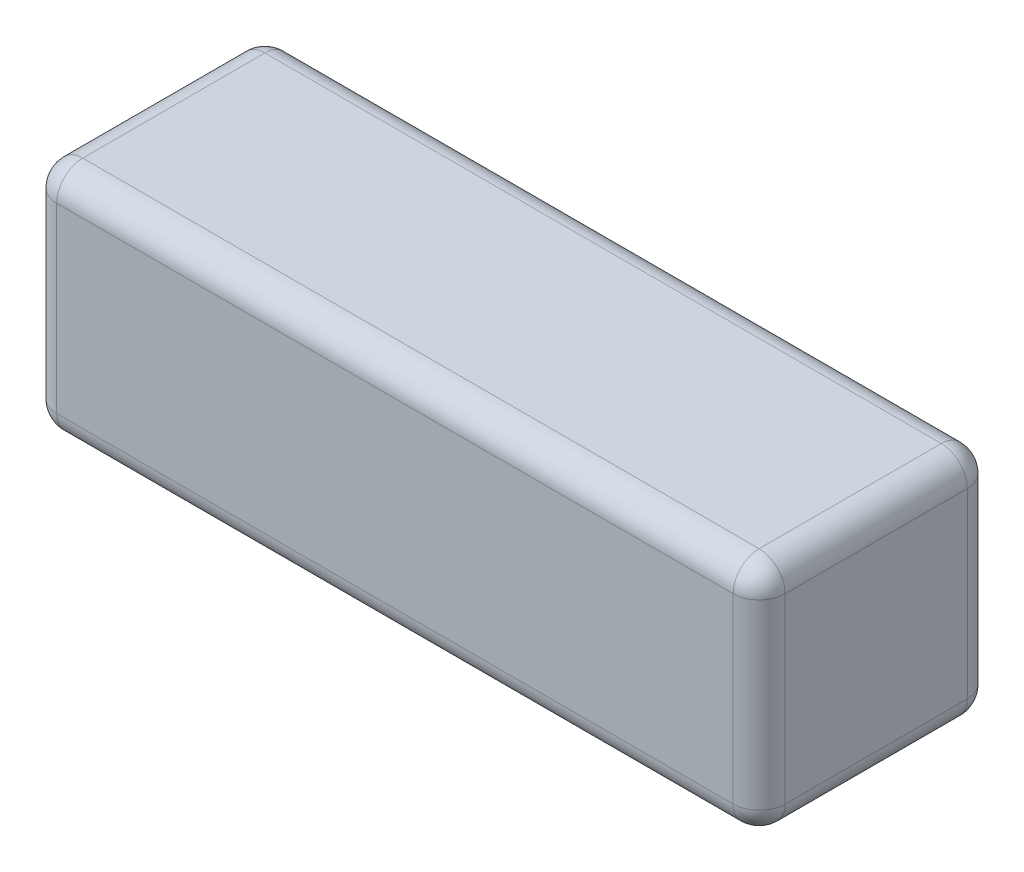
ISO-10303-21;
HEADER;
FILE_DESCRIPTION(('STEP AP214'),'2;1');
FILE_NAME('part.step','',(''),(''),'','','');
FILE_SCHEMA(('AUTOMOTIVE_DESIGN { 1 0 10303 214 1 1 1 1 }'));
ENDSEC;
DATA;
#1=APPLICATION_CONTEXT('core data for automotive mechanical design processes');
#2=APPLICATION_PROTOCOL_DEFINITION('international standard','automotive_design',2000,#1);
#3=PRODUCT_CONTEXT('',#1,'mechanical');
#4=PRODUCT('Part','Part','',(#3));
#5=PRODUCT_RELATED_PRODUCT_CATEGORY('part','',(#4));
#6=PRODUCT_DEFINITION_FORMATION('','',#4);
#7=PRODUCT_DEFINITION_CONTEXT('part definition',#1,'design');
#8=PRODUCT_DEFINITION('design','',#6,#7);
#9=PRODUCT_DEFINITION_SHAPE('','',#8);
#10=(LENGTH_UNIT() NAMED_UNIT(*) SI_UNIT(.MILLI.,.METRE.));
#11=(NAMED_UNIT(*) PLANE_ANGLE_UNIT() SI_UNIT($,.RADIAN.));
#12=(NAMED_UNIT(*) SI_UNIT($,.STERADIAN.) SOLID_ANGLE_UNIT());
#13=UNCERTAINTY_MEASURE_WITH_UNIT(LENGTH_MEASURE(1.E-05),#10,'distance_accuracy_value','');
#14=(GEOMETRIC_REPRESENTATION_CONTEXT(3) GLOBAL_UNCERTAINTY_ASSIGNED_CONTEXT((#13)) GLOBAL_UNIT_ASSIGNED_CONTEXT((#10,
#11,#12)) REPRESENTATION_CONTEXT('',''));
#15=CARTESIAN_POINT('',(0.,0.,0.));
#16=DIRECTION('',(0.,0.,1.));
#17=DIRECTION('',(1.,0.,0.));
#18=AXIS2_PLACEMENT_3D('',#15,#16,#17);
#19=CARTESIAN_POINT('',(70.,-22.5,45.));
#20=DIRECTION('',(-1.,0.,0.));
#21=DIRECTION('',(0.,0.,1.));
#22=AXIS2_PLACEMENT_3D('',#19,#20,#21);
#23=PLANE('',#22);
#24=DIRECTION('',(0.,1.,0.));
#25=VECTOR('',#24,1.);
#26=CARTESIAN_POINT('',(70.,-22.5,40.));
#27=LINE('',#26,#25);
#28=CARTESIAN_POINT('',(70.,17.5,40.));
#29=VERTEX_POINT('',#28);
#30=CARTESIAN_POINT('',(70.,-17.5,40.));
#31=VERTEX_POINT('',#30);
#32=EDGE_CURVE('E183',#29,#31,#27,.F.);
#33=ORIENTED_EDGE('',*,*,#32,.T.);
#34=DIRECTION('',(0.,0.,-1.));
#35=VECTOR('',#34,1.);
#36=CARTESIAN_POINT('',(70.,-17.5,45.));
#37=LINE('',#36,#35);
#38=CARTESIAN_POINT('',(70.,-17.5,5.));
#39=VERTEX_POINT('',#38);
#40=EDGE_CURVE('E188',#31,#39,#37,.T.);
#41=ORIENTED_EDGE('',*,*,#40,.T.);
#42=DIRECTION('',(0.,1.,0.));
#43=VECTOR('',#42,1.);
#44=CARTESIAN_POINT('',(70.,22.5,5.));
#45=LINE('',#44,#43);
#46=CARTESIAN_POINT('',(70.,17.5,5.));
#47=VERTEX_POINT('',#46);
#48=EDGE_CURVE('E185',#39,#47,#45,.T.);
#49=ORIENTED_EDGE('',*,*,#48,.T.);
#50=DIRECTION('',(0.,0.,-1.));
#51=VECTOR('',#50,1.);
#52=CARTESIAN_POINT('',(70.,17.5,45.));
#53=LINE('',#52,#51);
#54=EDGE_CURVE('E181',#47,#29,#53,.F.);
#55=ORIENTED_EDGE('',*,*,#54,.T.);
#56=EDGE_LOOP('',(#33,#41,#49,#55));
#57=FACE_BOUND('',#56,.T.);
#58=ADVANCED_FACE('F41',(#57),#23,.F.);
#59=CARTESIAN_POINT('',(-70.,22.5,45.));
#60=DIRECTION('',(0.,-1.,0.));
#61=DIRECTION('',(0.,0.,-1.));
#62=AXIS2_PLACEMENT_3D('',#59,#60,#61);
#63=PLANE('',#62);
#64=DIRECTION('',(-1.,0.,0.));
#65=VECTOR('',#64,1.);
#66=CARTESIAN_POINT('',(-70.,22.5,40.));
#67=LINE('',#66,#65);
#68=CARTESIAN_POINT('',(-65.,22.5,40.));
#69=VERTEX_POINT('',#68);
#70=CARTESIAN_POINT('',(65.,22.5,40.));
#71=VERTEX_POINT('',#70);
#72=EDGE_CURVE('E50',#69,#71,#67,.F.);
#73=ORIENTED_EDGE('',*,*,#72,.T.);
#74=DIRECTION('',(0.,0.,-1.));
#75=VECTOR('',#74,1.);
#76=CARTESIAN_POINT('',(65.,22.5,45.));
#77=LINE('',#76,#75);
#78=CARTESIAN_POINT('',(65.,22.5,5.));
#79=VERTEX_POINT('',#78);
#80=EDGE_CURVE('E11',#71,#79,#77,.T.);
#81=ORIENTED_EDGE('',*,*,#80,.T.);
#82=DIRECTION('',(-1.,0.,0.));
#83=VECTOR('',#82,1.);
#84=CARTESIAN_POINT('',(-70.,22.5,5.));
#85=LINE('',#84,#83);
#86=CARTESIAN_POINT('',(-65.,22.5,5.));
#87=VERTEX_POINT('',#86);
#88=EDGE_CURVE('E206',#79,#87,#85,.T.);
#89=ORIENTED_EDGE('',*,*,#88,.T.);
#90=DIRECTION('',(0.,0.,-1.));
#91=VECTOR('',#90,1.);
#92=CARTESIAN_POINT('',(-65.,22.5,45.));
#93=LINE('',#92,#91);
#94=EDGE_CURVE('E61',#87,#69,#93,.F.);
#95=ORIENTED_EDGE('',*,*,#94,.T.);
#96=EDGE_LOOP('',(#73,#81,#89,#95));
#97=FACE_BOUND('',#96,.T.);
#98=ADVANCED_FACE('F315',(#97),#63,.F.);
#99=CARTESIAN_POINT('',(-70.,-22.5,45.));
#100=DIRECTION('',(1.,0.,0.));
#101=DIRECTION('',(0.,0.,-1.));
#102=AXIS2_PLACEMENT_3D('',#99,#100,#101);
#103=PLANE('',#102);
#104=DIRECTION('',(0.,-1.,0.));
#105=VECTOR('',#104,1.);
#106=CARTESIAN_POINT('',(-70.,-22.5,5.));
#107=LINE('',#106,#105);
#108=CARTESIAN_POINT('',(-70.,17.5,5.));
#109=VERTEX_POINT('',#108);
#110=CARTESIAN_POINT('',(-70.,-17.5,5.));
#111=VERTEX_POINT('',#110);
#112=EDGE_CURVE('E140',#109,#111,#107,.T.);
#113=ORIENTED_EDGE('',*,*,#112,.T.);
#114=DIRECTION('',(0.,0.,-1.));
#115=VECTOR('',#114,1.);
#116=CARTESIAN_POINT('',(-70.,-17.5,45.));
#117=LINE('',#116,#115);
#118=CARTESIAN_POINT('',(-70.,-17.5,40.));
#119=VERTEX_POINT('',#118);
#120=EDGE_CURVE('E136',#111,#119,#117,.F.);
#121=ORIENTED_EDGE('',*,*,#120,.T.);
#122=DIRECTION('',(0.,-1.,0.));
#123=VECTOR('',#122,1.);
#124=CARTESIAN_POINT('',(-70.,-22.5,40.));
#125=LINE('',#124,#123);
#126=CARTESIAN_POINT('',(-70.,17.5,40.));
#127=VERTEX_POINT('',#126);
#128=EDGE_CURVE('E128',#119,#127,#125,.F.);
#129=ORIENTED_EDGE('',*,*,#128,.T.);
#130=DIRECTION('',(0.,0.,-1.));
#131=VECTOR('',#130,1.);
#132=CARTESIAN_POINT('',(-70.,17.5,45.));
#133=LINE('',#132,#131);
#134=EDGE_CURVE('E133',#127,#109,#133,.T.);
#135=ORIENTED_EDGE('',*,*,#134,.T.);
#136=EDGE_LOOP('',(#113,#121,#129,#135));
#137=FACE_BOUND('',#136,.T.);
#138=ADVANCED_FACE('F131',(#137),#103,.F.);
#139=CARTESIAN_POINT('',(-70.,-22.5,45.));
#140=DIRECTION('',(0.,1.,0.));
#141=DIRECTION('',(0.,0.,1.));
#142=AXIS2_PLACEMENT_3D('',#139,#140,#141);
#143=PLANE('',#142);
#144=DIRECTION('',(1.,0.,0.));
#145=VECTOR('',#144,1.);
#146=CARTESIAN_POINT('',(-70.,-22.5,40.));
#147=LINE('',#146,#145);
#148=CARTESIAN_POINT('',(65.,-22.5,40.));
#149=VERTEX_POINT('',#148);
#150=CARTESIAN_POINT('',(-65.,-22.5,40.));
#151=VERTEX_POINT('',#150);
#152=EDGE_CURVE('E201',#149,#151,#147,.F.);
#153=ORIENTED_EDGE('',*,*,#152,.T.);
#154=DIRECTION('',(0.,0.,-1.));
#155=VECTOR('',#154,1.);
#156=CARTESIAN_POINT('',(-65.,-22.5,45.));
#157=LINE('',#156,#155);
#158=CARTESIAN_POINT('',(-65.,-22.5,5.));
#159=VERTEX_POINT('',#158);
#160=EDGE_CURVE('E203',#151,#159,#157,.T.);
#161=ORIENTED_EDGE('',*,*,#160,.T.);
#162=DIRECTION('',(1.,0.,0.));
#163=VECTOR('',#162,1.);
#164=CARTESIAN_POINT('',(70.,-22.5,5.));
#165=LINE('',#164,#163);
#166=CARTESIAN_POINT('',(65.,-22.5,5.));
#167=VERTEX_POINT('',#166);
#168=EDGE_CURVE('E197',#159,#167,#165,.T.);
#169=ORIENTED_EDGE('',*,*,#168,.T.);
#170=DIRECTION('',(0.,0.,-1.));
#171=VECTOR('',#170,1.);
#172=CARTESIAN_POINT('',(65.,-22.5,45.));
#173=LINE('',#172,#171);
#174=EDGE_CURVE('E199',#167,#149,#173,.F.);
#175=ORIENTED_EDGE('',*,*,#174,.T.);
#176=EDGE_LOOP('',(#153,#161,#169,#175));
#177=FACE_BOUND('',#176,.T.);
#178=ADVANCED_FACE('F272',(#177),#143,.F.);
#179=CARTESIAN_POINT('',(0.,0.,45.));
#180=DIRECTION('',(0.,0.,-1.));
#181=DIRECTION('',(-1.,0.,0.));
#182=AXIS2_PLACEMENT_3D('',#179,#180,#181);
#183=PLANE('',#182);
#184=DIRECTION('',(0.,-1.,0.));
#185=VECTOR('',#184,1.);
#186=CARTESIAN_POINT('',(-65.,0.,45.));
#187=LINE('',#186,#185);
#188=CARTESIAN_POINT('',(-65.,17.5,45.));
#189=VERTEX_POINT('',#188);
#190=CARTESIAN_POINT('',(-65.,-17.5,45.));
#191=VERTEX_POINT('',#190);
#192=EDGE_CURVE('E148',#189,#191,#187,.T.);
#193=ORIENTED_EDGE('',*,*,#192,.T.);
#194=DIRECTION('',(1.,0.,0.));
#195=VECTOR('',#194,1.);
#196=CARTESIAN_POINT('',(0.,-17.5,45.));
#197=LINE('',#196,#195);
#198=CARTESIAN_POINT('',(65.,-17.5,45.));
#199=VERTEX_POINT('',#198);
#200=EDGE_CURVE('E195',#191,#199,#197,.T.);
#201=ORIENTED_EDGE('',*,*,#200,.T.);
#202=DIRECTION('',(0.,1.,0.));
#203=VECTOR('',#202,1.);
#204=CARTESIAN_POINT('',(65.,0.,45.));
#205=LINE('',#204,#203);
#206=CARTESIAN_POINT('',(65.,17.5,45.));
#207=VERTEX_POINT('',#206);
#208=EDGE_CURVE('E192',#199,#207,#205,.T.);
#209=ORIENTED_EDGE('',*,*,#208,.T.);
#210=DIRECTION('',(-1.,0.,0.));
#211=VECTOR('',#210,1.);
#212=CARTESIAN_POINT('',(0.,17.5,45.));
#213=LINE('',#212,#211);
#214=EDGE_CURVE('E190',#207,#189,#213,.T.);
#215=ORIENTED_EDGE('',*,*,#214,.T.);
#216=EDGE_LOOP('',(#193,#201,#209,#215));
#217=FACE_BOUND('',#216,.T.);
#218=ADVANCED_FACE('F303',(#217),#183,.F.);
#219=CARTESIAN_POINT('',(0.,0.,0.));
#220=DIRECTION('',(0.,0.,-1.));
#221=DIRECTION('',(-1.,0.,0.));
#222=AXIS2_PLACEMENT_3D('',#219,#220,#221);
#223=PLANE('',#222);
#224=DIRECTION('',(0.,1.,0.));
#225=VECTOR('',#224,1.);
#226=CARTESIAN_POINT('',(65.,-22.5,0.));
#227=LINE('',#226,#225);
#228=CARTESIAN_POINT('',(65.,17.5,0.));
#229=VERTEX_POINT('',#228);
#230=CARTESIAN_POINT('',(65.,-17.5,0.));
#231=VERTEX_POINT('',#230);
#232=EDGE_CURVE('E174',#229,#231,#227,.F.);
#233=ORIENTED_EDGE('',*,*,#232,.T.);
#234=DIRECTION('',(1.,0.,0.));
#235=VECTOR('',#234,1.);
#236=CARTESIAN_POINT('',(-70.,-17.5,0.));
#237=LINE('',#236,#235);
#238=CARTESIAN_POINT('',(-65.,-17.5,0.));
#239=VERTEX_POINT('',#238);
#240=EDGE_CURVE('E179',#231,#239,#237,.F.);
#241=ORIENTED_EDGE('',*,*,#240,.T.);
#242=DIRECTION('',(0.,-1.,0.));
#243=VECTOR('',#242,1.);
#244=CARTESIAN_POINT('',(-65.,22.5,0.));
#245=LINE('',#244,#243);
#246=CARTESIAN_POINT('',(-65.,17.5,0.));
#247=VERTEX_POINT('',#246);
#248=EDGE_CURVE('E176',#239,#247,#245,.F.);
#249=ORIENTED_EDGE('',*,*,#248,.T.);
#250=DIRECTION('',(-1.,0.,0.));
#251=VECTOR('',#250,1.);
#252=CARTESIAN_POINT('',(70.,17.5,0.));
#253=LINE('',#252,#251);
#254=EDGE_CURVE('E172',#247,#229,#253,.F.);
#255=ORIENTED_EDGE('',*,*,#254,.T.);
#256=EDGE_LOOP('',(#233,#241,#249,#255));
#257=FACE_BOUND('',#256,.T.);
#258=ADVANCED_FACE('F305',(#257),#223,.T.);
#259=CARTESIAN_POINT('',(65.,0.,40.));
#260=DIRECTION('',(0.,1.,0.));
#261=DIRECTION('',(0.,0.,1.));
#262=AXIS2_PLACEMENT_3D('',#259,#260,#261);
#263=CYLINDRICAL_SURFACE('',#262,5.);
#264=CARTESIAN_POINT('',(65.,17.5,40.));
#265=DIRECTION('',(0.,1.,0.));
#266=DIRECTION('',(0.,0.,1.));
#267=AXIS2_PLACEMENT_3D('',#264,#265,#266);
#268=CIRCLE('',#267,5.);
#269=EDGE_CURVE('E45',#207,#29,#268,.T.);
#270=ORIENTED_EDGE('',*,*,#269,.F.);
#271=ORIENTED_EDGE('',*,*,#208,.F.);
#272=CARTESIAN_POINT('',(65.,-17.5,40.));
#273=DIRECTION('',(0.,-1.,0.));
#274=DIRECTION('',(0.,0.,-1.));
#275=AXIS2_PLACEMENT_3D('',#272,#273,#274);
#276=CIRCLE('',#275,5.);
#277=EDGE_CURVE('E168',#31,#199,#276,.T.);
#278=ORIENTED_EDGE('',*,*,#277,.F.);
#279=ORIENTED_EDGE('',*,*,#32,.F.);
#280=EDGE_LOOP('',(#270,#271,#278,#279));
#281=FACE_BOUND('',#280,.T.);
#282=ADVANCED_FACE('F43',(#281),#263,.T.);
#283=CARTESIAN_POINT('',(65.,17.5,40.));
#284=DIRECTION('',(1.,0.,0.));
#285=DIRECTION('',(0.,0.,-1.));
#286=AXIS2_PLACEMENT_3D('',#283,#284,#285);
#287=SPHERICAL_SURFACE('',#286,5.);
#288=CARTESIAN_POINT('',(65.,17.5,40.));
#289=DIRECTION('',(1.,0.,0.));
#290=DIRECTION('',(0.,0.,-1.));
#291=AXIS2_PLACEMENT_3D('',#288,#289,#290);
#292=CIRCLE('',#291,5.);
#293=EDGE_CURVE('E251',#207,#71,#292,.F.);
#294=ORIENTED_EDGE('',*,*,#293,.F.);
#295=ORIENTED_EDGE('',*,*,#269,.T.);
#296=CARTESIAN_POINT('',(65.,17.5,40.));
#297=DIRECTION('',(0.,0.,1.));
#298=DIRECTION('',(1.,0.,0.));
#299=AXIS2_PLACEMENT_3D('',#296,#297,#298);
#300=CIRCLE('',#299,5.);
#301=EDGE_CURVE('E253',#71,#29,#300,.F.);
#302=ORIENTED_EDGE('',*,*,#301,.F.);
#303=EDGE_LOOP('',(#294,#295,#302));
#304=FACE_BOUND('',#303,.T.);
#305=ADVANCED_FACE('F298',(#304),#287,.T.);
#306=CARTESIAN_POINT('',(65.,-17.5,40.));
#307=DIRECTION('',(0.,0.,1.));
#308=DIRECTION('',(1.,0.,0.));
#309=AXIS2_PLACEMENT_3D('',#306,#307,#308);
#310=SPHERICAL_SURFACE('',#309,5.);
#311=CARTESIAN_POINT('',(65.,-17.5,40.));
#312=DIRECTION('',(0.,0.,1.));
#313=DIRECTION('',(1.,0.,0.));
#314=AXIS2_PLACEMENT_3D('',#311,#312,#313);
#315=CIRCLE('',#314,5.);
#316=EDGE_CURVE('E245',#31,#149,#315,.F.);
#317=ORIENTED_EDGE('',*,*,#316,.F.);
#318=ORIENTED_EDGE('',*,*,#277,.T.);
#319=CARTESIAN_POINT('',(65.,-17.5,40.));
#320=DIRECTION('',(1.,0.,0.));
#321=DIRECTION('',(0.,0.,-1.));
#322=AXIS2_PLACEMENT_3D('',#319,#320,#321);
#323=CIRCLE('',#322,5.);
#324=EDGE_CURVE('E248',#149,#199,#323,.F.);
#325=ORIENTED_EDGE('',*,*,#324,.F.);
#326=EDGE_LOOP('',(#317,#318,#325));
#327=FACE_BOUND('',#326,.T.);
#328=ADVANCED_FACE('F260',(#327),#310,.T.);
#329=CARTESIAN_POINT('',(65.,17.5,45.));
#330=DIRECTION('',(0.,0.,-1.));
#331=DIRECTION('',(-1.,0.,0.));
#332=AXIS2_PLACEMENT_3D('',#329,#330,#331);
#333=CYLINDRICAL_SURFACE('',#332,5.);
#334=ORIENTED_EDGE('',*,*,#301,.T.);
#335=ORIENTED_EDGE('',*,*,#54,.F.);
#336=CARTESIAN_POINT('',(65.,17.5,5.));
#337=DIRECTION('',(0.,0.,-1.));
#338=DIRECTION('',(-1.,0.,0.));
#339=AXIS2_PLACEMENT_3D('',#336,#337,#338);
#340=CIRCLE('',#339,5.);
#341=EDGE_CURVE('E240',#79,#47,#340,.T.);
#342=ORIENTED_EDGE('',*,*,#341,.F.);
#343=ORIENTED_EDGE('',*,*,#80,.F.);
#344=EDGE_LOOP('',(#334,#335,#342,#343));
#345=FACE_BOUND('',#344,.T.);
#346=ADVANCED_FACE('F292',(#345),#333,.T.);
#347=CARTESIAN_POINT('',(0.,17.5,40.));
#348=DIRECTION('',(-1.,0.,0.));
#349=DIRECTION('',(0.,0.,1.));
#350=AXIS2_PLACEMENT_3D('',#347,#348,#349);
#351=CYLINDRICAL_SURFACE('',#350,5.);
#352=ORIENTED_EDGE('',*,*,#293,.T.);
#353=ORIENTED_EDGE('',*,*,#72,.F.);
#354=CARTESIAN_POINT('',(-65.,17.5,40.));
#355=DIRECTION('',(-1.,0.,0.));
#356=DIRECTION('',(0.,0.,1.));
#357=AXIS2_PLACEMENT_3D('',#354,#355,#356);
#358=CIRCLE('',#357,5.);
#359=EDGE_CURVE('E152',#189,#69,#358,.T.);
#360=ORIENTED_EDGE('',*,*,#359,.F.);
#361=ORIENTED_EDGE('',*,*,#214,.F.);
#362=EDGE_LOOP('',(#352,#353,#360,#361));
#363=FACE_BOUND('',#362,.T.);
#364=ADVANCED_FACE('F301',(#363),#351,.T.);
#365=CARTESIAN_POINT('',(-65.,0.,40.));
#366=DIRECTION('',(0.,-1.,0.));
#367=DIRECTION('',(0.,0.,-1.));
#368=AXIS2_PLACEMENT_3D('',#365,#366,#367);
#369=CYLINDRICAL_SURFACE('',#368,5.);
#370=CARTESIAN_POINT('',(-65.,-17.5,40.));
#371=DIRECTION('',(0.,-1.,0.));
#372=DIRECTION('',(0.,0.,-1.));
#373=AXIS2_PLACEMENT_3D('',#370,#371,#372);
#374=CIRCLE('',#373,5.);
#375=EDGE_CURVE('E153',#191,#119,#374,.T.);
#376=ORIENTED_EDGE('',*,*,#375,.F.);
#377=ORIENTED_EDGE('',*,*,#192,.F.);
#378=CARTESIAN_POINT('',(-65.,17.5,40.));
#379=DIRECTION('',(0.,1.,0.));
#380=DIRECTION('',(0.,0.,1.));
#381=AXIS2_PLACEMENT_3D('',#378,#379,#380);
#382=CIRCLE('',#381,5.);
#383=EDGE_CURVE('E144',#127,#189,#382,.T.);
#384=ORIENTED_EDGE('',*,*,#383,.F.);
#385=ORIENTED_EDGE('',*,*,#128,.F.);
#386=EDGE_LOOP('',(#376,#377,#384,#385));
#387=FACE_BOUND('',#386,.T.);
#388=ADVANCED_FACE('F146',(#387),#369,.T.);
#389=CARTESIAN_POINT('',(0.,-17.5,40.));
#390=DIRECTION('',(1.,0.,0.));
#391=DIRECTION('',(0.,0.,-1.));
#392=AXIS2_PLACEMENT_3D('',#389,#390,#391);
#393=CYLINDRICAL_SURFACE('',#392,5.);
#394=ORIENTED_EDGE('',*,*,#324,.T.);
#395=ORIENTED_EDGE('',*,*,#200,.F.);
#396=CARTESIAN_POINT('',(-65.,-17.5,40.));
#397=DIRECTION('',(-1.,0.,0.));
#398=DIRECTION('',(0.,0.,1.));
#399=AXIS2_PLACEMENT_3D('',#396,#397,#398);
#400=CIRCLE('',#399,5.);
#401=EDGE_CURVE('E236',#151,#191,#400,.T.);
#402=ORIENTED_EDGE('',*,*,#401,.F.);
#403=ORIENTED_EDGE('',*,*,#152,.F.);
#404=EDGE_LOOP('',(#394,#395,#402,#403));
#405=FACE_BOUND('',#404,.T.);
#406=ADVANCED_FACE('F268',(#405),#393,.T.);
#407=CARTESIAN_POINT('',(65.,-17.5,45.));
#408=DIRECTION('',(0.,0.,-1.));
#409=DIRECTION('',(-1.,0.,0.));
#410=AXIS2_PLACEMENT_3D('',#407,#408,#409);
#411=CYLINDRICAL_SURFACE('',#410,5.);
#412=ORIENTED_EDGE('',*,*,#316,.T.);
#413=ORIENTED_EDGE('',*,*,#174,.F.);
#414=CARTESIAN_POINT('',(65.,-17.5,5.));
#415=DIRECTION('',(0.,0.,-1.));
#416=DIRECTION('',(-1.,0.,0.));
#417=AXIS2_PLACEMENT_3D('',#414,#415,#416);
#418=CIRCLE('',#417,5.);
#419=EDGE_CURVE('E233',#39,#167,#418,.T.);
#420=ORIENTED_EDGE('',*,*,#419,.F.);
#421=ORIENTED_EDGE('',*,*,#40,.F.);
#422=EDGE_LOOP('',(#412,#413,#420,#421));
#423=FACE_BOUND('',#422,.T.);
#424=ADVANCED_FACE('F278',(#423),#411,.T.);
#425=CARTESIAN_POINT('',(65.,-22.5,5.));
#426=DIRECTION('',(0.,-1.,0.));
#427=DIRECTION('',(0.,0.,-1.));
#428=AXIS2_PLACEMENT_3D('',#425,#426,#427);
#429=CYLINDRICAL_SURFACE('',#428,5.);
#430=CARTESIAN_POINT('',(65.,17.5,5.));
#431=DIRECTION('',(0.,1.,0.));
#432=DIRECTION('',(0.,0.,1.));
#433=AXIS2_PLACEMENT_3D('',#430,#431,#432);
#434=CIRCLE('',#433,5.);
#435=EDGE_CURVE('E242',#47,#229,#434,.T.);
#436=ORIENTED_EDGE('',*,*,#435,.F.);
#437=ORIENTED_EDGE('',*,*,#48,.F.);
#438=CARTESIAN_POINT('',(65.,-17.5,5.));
#439=DIRECTION('',(0.,-1.,0.));
#440=DIRECTION('',(0.,0.,-1.));
#441=AXIS2_PLACEMENT_3D('',#438,#439,#440);
#442=CIRCLE('',#441,5.);
#443=EDGE_CURVE('E230',#231,#39,#442,.T.);
#444=ORIENTED_EDGE('',*,*,#443,.F.);
#445=ORIENTED_EDGE('',*,*,#232,.F.);
#446=EDGE_LOOP('',(#436,#437,#444,#445));
#447=FACE_BOUND('',#446,.T.);
#448=ADVANCED_FACE('F284',(#447),#429,.T.);
#449=CARTESIAN_POINT('',(65.,17.5,5.));
#450=DIRECTION('',(1.,0.,0.));
#451=DIRECTION('',(0.,0.,-1.));
#452=AXIS2_PLACEMENT_3D('',#449,#450,#451);
#453=SPHERICAL_SURFACE('',#452,5.);
#454=ORIENTED_EDGE('',*,*,#341,.T.);
#455=ORIENTED_EDGE('',*,*,#435,.T.);
#456=CARTESIAN_POINT('',(65.,17.5,5.));
#457=DIRECTION('',(1.,0.,0.));
#458=DIRECTION('',(0.,1.,0.));
#459=AXIS2_PLACEMENT_3D('',#456,#457,#458);
#460=CIRCLE('',#459,5.);
#461=EDGE_CURVE('E159',#79,#229,#460,.F.);
#462=ORIENTED_EDGE('',*,*,#461,.F.);
#463=EDGE_LOOP('',(#454,#455,#462));
#464=FACE_BOUND('',#463,.T.);
#465=ADVANCED_FACE('F359',(#464),#453,.T.);
#466=CARTESIAN_POINT('',(-65.,17.5,40.));
#467=DIRECTION('',(0.,0.,1.));
#468=DIRECTION('',(1.,0.,0.));
#469=AXIS2_PLACEMENT_3D('',#466,#467,#468);
#470=SPHERICAL_SURFACE('',#469,5.);
#471=ORIENTED_EDGE('',*,*,#383,.T.);
#472=ORIENTED_EDGE('',*,*,#359,.T.);
#473=CARTESIAN_POINT('',(-65.,17.5,40.));
#474=DIRECTION('',(0.,0.,1.));
#475=DIRECTION('',(1.,0.,0.));
#476=AXIS2_PLACEMENT_3D('',#473,#474,#475);
#477=CIRCLE('',#476,5.);
#478=EDGE_CURVE('E156',#127,#69,#477,.F.);
#479=ORIENTED_EDGE('',*,*,#478,.F.);
#480=EDGE_LOOP('',(#471,#472,#479));
#481=FACE_BOUND('',#480,.T.);
#482=ADVANCED_FACE('F157',(#481),#470,.T.);
#483=CARTESIAN_POINT('',(-65.,-17.5,40.));
#484=DIRECTION('',(0.,0.,1.));
#485=DIRECTION('',(1.,0.,0.));
#486=AXIS2_PLACEMENT_3D('',#483,#484,#485);
#487=SPHERICAL_SURFACE('',#486,5.);
#488=ORIENTED_EDGE('',*,*,#401,.T.);
#489=ORIENTED_EDGE('',*,*,#375,.T.);
#490=CARTESIAN_POINT('',(-65.,-17.5,40.));
#491=DIRECTION('',(0.,0.,1.));
#492=DIRECTION('',(1.,0.,0.));
#493=AXIS2_PLACEMENT_3D('',#490,#491,#492);
#494=CIRCLE('',#493,5.);
#495=EDGE_CURVE('E160',#151,#119,#494,.F.);
#496=ORIENTED_EDGE('',*,*,#495,.F.);
#497=EDGE_LOOP('',(#488,#489,#496));
#498=FACE_BOUND('',#497,.T.);
#499=ADVANCED_FACE('F352',(#498),#487,.T.);
#500=CARTESIAN_POINT('',(65.,-17.5,5.));
#501=DIRECTION('',(1.,0.,0.));
#502=DIRECTION('',(0.,0.,-1.));
#503=AXIS2_PLACEMENT_3D('',#500,#501,#502);
#504=SPHERICAL_SURFACE('',#503,5.);
#505=ORIENTED_EDGE('',*,*,#443,.T.);
#506=ORIENTED_EDGE('',*,*,#419,.T.);
#507=CARTESIAN_POINT('',(65.,-17.5,5.));
#508=DIRECTION('',(1.,0.,0.));
#509=DIRECTION('',(0.,0.,-1.));
#510=AXIS2_PLACEMENT_3D('',#507,#508,#509);
#511=CIRCLE('',#510,5.);
#512=EDGE_CURVE('E223',#231,#167,#511,.F.);
#513=ORIENTED_EDGE('',*,*,#512,.F.);
#514=EDGE_LOOP('',(#505,#506,#513));
#515=FACE_BOUND('',#514,.T.);
#516=ADVANCED_FACE('F348',(#515),#504,.T.);
#517=CARTESIAN_POINT('',(-70.,17.5,5.));
#518=DIRECTION('',(1.,0.,0.));
#519=DIRECTION('',(0.,0.,-1.));
#520=AXIS2_PLACEMENT_3D('',#517,#518,#519);
#521=CYLINDRICAL_SURFACE('',#520,5.);
#522=ORIENTED_EDGE('',*,*,#461,.T.);
#523=ORIENTED_EDGE('',*,*,#254,.F.);
#524=CARTESIAN_POINT('',(-65.,17.5,5.));
#525=DIRECTION('',(-1.,0.,0.));
#526=DIRECTION('',(0.,0.,1.));
#527=AXIS2_PLACEMENT_3D('',#524,#525,#526);
#528=CIRCLE('',#527,5.);
#529=EDGE_CURVE('E220',#87,#247,#528,.T.);
#530=ORIENTED_EDGE('',*,*,#529,.F.);
#531=ORIENTED_EDGE('',*,*,#88,.F.);
#532=EDGE_LOOP('',(#522,#523,#530,#531));
#533=FACE_BOUND('',#532,.T.);
#534=ADVANCED_FACE('F345',(#533),#521,.T.);
#535=CARTESIAN_POINT('',(-65.,17.5,45.));
#536=DIRECTION('',(0.,0.,-1.));
#537=DIRECTION('',(-1.,0.,0.));
#538=AXIS2_PLACEMENT_3D('',#535,#536,#537);
#539=CYLINDRICAL_SURFACE('',#538,5.);
#540=ORIENTED_EDGE('',*,*,#478,.T.);
#541=ORIENTED_EDGE('',*,*,#94,.F.);
#542=CARTESIAN_POINT('',(-65.,17.5,5.));
#543=DIRECTION('',(0.,0.,-1.));
#544=DIRECTION('',(-1.,0.,0.));
#545=AXIS2_PLACEMENT_3D('',#542,#543,#544);
#546=CIRCLE('',#545,5.);
#547=EDGE_CURVE('E164',#109,#87,#546,.T.);
#548=ORIENTED_EDGE('',*,*,#547,.F.);
#549=ORIENTED_EDGE('',*,*,#134,.F.);
#550=EDGE_LOOP('',(#540,#541,#548,#549));
#551=FACE_BOUND('',#550,.T.);
#552=ADVANCED_FACE('F162',(#551),#539,.T.);
#553=CARTESIAN_POINT('',(-65.,-17.5,45.));
#554=DIRECTION('',(0.,0.,-1.));
#555=DIRECTION('',(-1.,0.,0.));
#556=AXIS2_PLACEMENT_3D('',#553,#554,#555);
#557=CYLINDRICAL_SURFACE('',#556,5.);
#558=ORIENTED_EDGE('',*,*,#495,.T.);
#559=ORIENTED_EDGE('',*,*,#120,.F.);
#560=CARTESIAN_POINT('',(-65.,-17.5,5.));
#561=DIRECTION('',(0.,0.,-1.));
#562=DIRECTION('',(-1.,0.,0.));
#563=AXIS2_PLACEMENT_3D('',#560,#561,#562);
#564=CIRCLE('',#563,5.);
#565=EDGE_CURVE('E216',#159,#111,#564,.T.);
#566=ORIENTED_EDGE('',*,*,#565,.F.);
#567=ORIENTED_EDGE('',*,*,#160,.F.);
#568=EDGE_LOOP('',(#558,#559,#566,#567));
#569=FACE_BOUND('',#568,.T.);
#570=ADVANCED_FACE('F338',(#569),#557,.T.);
#571=CARTESIAN_POINT('',(-70.,-17.5,5.));
#572=DIRECTION('',(-1.,0.,0.));
#573=DIRECTION('',(0.,0.,1.));
#574=AXIS2_PLACEMENT_3D('',#571,#572,#573);
#575=CYLINDRICAL_SURFACE('',#574,5.);
#576=ORIENTED_EDGE('',*,*,#512,.T.);
#577=ORIENTED_EDGE('',*,*,#168,.F.);
#578=CARTESIAN_POINT('',(-65.,-17.5,5.));
#579=DIRECTION('',(-1.,0.,0.));
#580=DIRECTION('',(0.,0.,1.));
#581=AXIS2_PLACEMENT_3D('',#578,#579,#580);
#582=CIRCLE('',#581,5.);
#583=EDGE_CURVE('E214',#239,#159,#582,.T.);
#584=ORIENTED_EDGE('',*,*,#583,.F.);
#585=ORIENTED_EDGE('',*,*,#240,.F.);
#586=EDGE_LOOP('',(#576,#577,#584,#585));
#587=FACE_BOUND('',#586,.T.);
#588=ADVANCED_FACE('F334',(#587),#575,.T.);
#589=CARTESIAN_POINT('',(-65.,17.5,5.));
#590=DIRECTION('',(0.,1.,0.));
#591=DIRECTION('',(0.,0.,1.));
#592=AXIS2_PLACEMENT_3D('',#589,#590,#591);
#593=SPHERICAL_SURFACE('',#592,5.);
#594=ORIENTED_EDGE('',*,*,#547,.T.);
#595=ORIENTED_EDGE('',*,*,#529,.T.);
#596=CARTESIAN_POINT('',(-65.,17.5,5.));
#597=DIRECTION('',(0.,1.,0.));
#598=DIRECTION('',(-1.,0.,0.));
#599=AXIS2_PLACEMENT_3D('',#596,#597,#598);
#600=CIRCLE('',#599,5.);
#601=EDGE_CURVE('E212',#109,#247,#600,.F.);
#602=ORIENTED_EDGE('',*,*,#601,.F.);
#603=EDGE_LOOP('',(#594,#595,#602));
#604=FACE_BOUND('',#603,.T.);
#605=ADVANCED_FACE('F330',(#604),#593,.T.);
#606=CARTESIAN_POINT('',(-65.,-17.5,5.));
#607=DIRECTION('',(0.,-1.,0.));
#608=DIRECTION('',(0.,0.,-1.));
#609=AXIS2_PLACEMENT_3D('',#606,#607,#608);
#610=SPHERICAL_SURFACE('',#609,5.);
#611=ORIENTED_EDGE('',*,*,#583,.T.);
#612=ORIENTED_EDGE('',*,*,#565,.T.);
#613=CARTESIAN_POINT('',(-65.,-17.5,5.));
#614=DIRECTION('',(0.,-1.,0.));
#615=DIRECTION('',(0.,0.,-1.));
#616=AXIS2_PLACEMENT_3D('',#613,#614,#615);
#617=CIRCLE('',#616,5.);
#618=EDGE_CURVE('E210',#239,#111,#617,.F.);
#619=ORIENTED_EDGE('',*,*,#618,.F.);
#620=EDGE_LOOP('',(#611,#612,#619));
#621=FACE_BOUND('',#620,.T.);
#622=ADVANCED_FACE('F326',(#621),#610,.T.);
#623=CARTESIAN_POINT('',(-65.,-22.5,5.));
#624=DIRECTION('',(0.,1.,0.));
#625=DIRECTION('',(0.,0.,1.));
#626=AXIS2_PLACEMENT_3D('',#623,#624,#625);
#627=CYLINDRICAL_SURFACE('',#626,5.);
#628=ORIENTED_EDGE('',*,*,#601,.T.);
#629=ORIENTED_EDGE('',*,*,#248,.F.);
#630=ORIENTED_EDGE('',*,*,#618,.T.);
#631=ORIENTED_EDGE('',*,*,#112,.F.);
#632=EDGE_LOOP('',(#628,#629,#630,#631));
#633=FACE_BOUND('',#632,.T.);
#634=ADVANCED_FACE('F323',(#633),#627,.T.);
#635=CLOSED_SHELL('',(#58,#98,#138,#178,#218,#258,#282,#305,#328,#346,#364,#388,#406,#424,#448,
#465,#482,#499,#516,#534,#552,#570,#588,#605,#622,#634));
#636=MANIFOLD_SOLID_BREP('B2',#635);
#637=ADVANCED_BREP_SHAPE_REPRESENTATION('',(#18,#636),#14);
#638=SHAPE_DEFINITION_REPRESENTATION(#9,#637);
ENDSEC;
END-ISO-10303-21;
